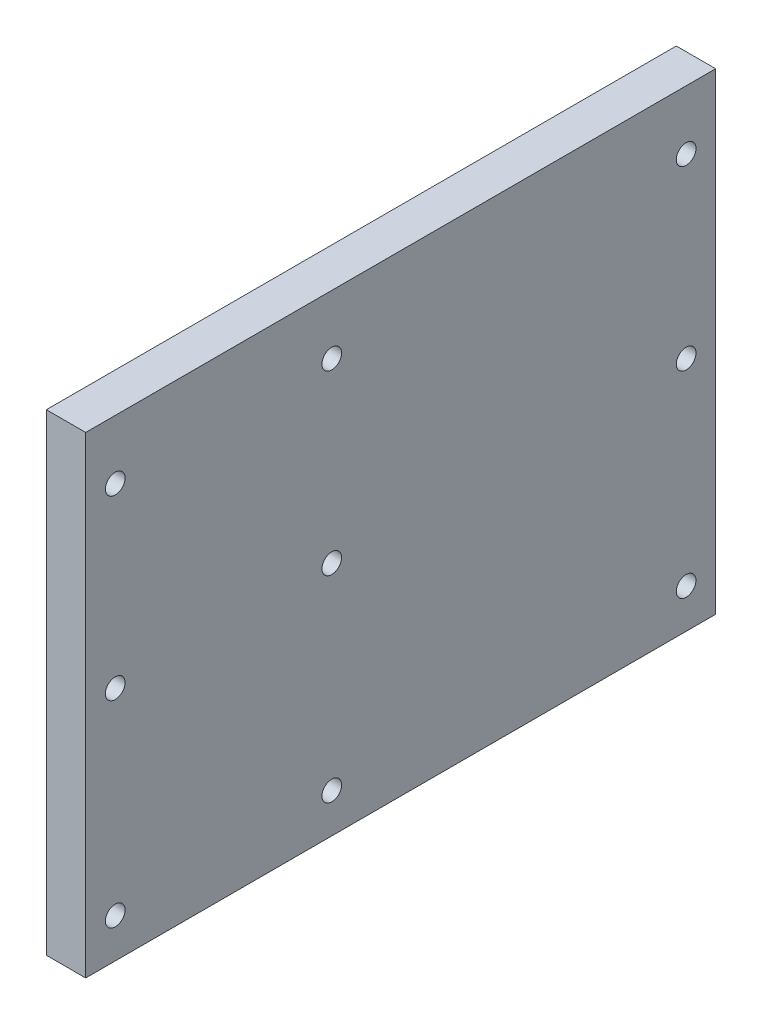
ISO-10303-21;
HEADER;
FILE_DESCRIPTION(('STEP AP214'),'2;1');
FILE_NAME('part.step','',(''),(''),'','','');
FILE_SCHEMA(('AUTOMOTIVE_DESIGN { 1 0 10303 214 1 1 1 1 }'));
ENDSEC;
DATA;
#1=APPLICATION_CONTEXT('core data for automotive mechanical design processes');
#2=APPLICATION_PROTOCOL_DEFINITION('international standard','automotive_design',2000,#1);
#3=PRODUCT_CONTEXT('',#1,'mechanical');
#4=PRODUCT('Part','Part','',(#3));
#5=PRODUCT_RELATED_PRODUCT_CATEGORY('part','',(#4));
#6=PRODUCT_DEFINITION_FORMATION('','',#4);
#7=PRODUCT_DEFINITION_CONTEXT('part definition',#1,'design');
#8=PRODUCT_DEFINITION('design','',#6,#7);
#9=PRODUCT_DEFINITION_SHAPE('','',#8);
#10=(LENGTH_UNIT() NAMED_UNIT(*) SI_UNIT(.MILLI.,.METRE.));
#11=(NAMED_UNIT(*) PLANE_ANGLE_UNIT() SI_UNIT($,.RADIAN.));
#12=(NAMED_UNIT(*) SI_UNIT($,.STERADIAN.) SOLID_ANGLE_UNIT());
#13=UNCERTAINTY_MEASURE_WITH_UNIT(LENGTH_MEASURE(1.E-05),#10,'distance_accuracy_value','');
#14=(GEOMETRIC_REPRESENTATION_CONTEXT(3) GLOBAL_UNCERTAINTY_ASSIGNED_CONTEXT((#13)) GLOBAL_UNIT_ASSIGNED_CONTEXT((#10,
#11,#12)) REPRESENTATION_CONTEXT('',''));
#15=CARTESIAN_POINT('',(0.,0.,0.));
#16=DIRECTION('',(0.,0.,1.));
#17=DIRECTION('',(1.,0.,0.));
#18=AXIS2_PLACEMENT_3D('',#15,#16,#17);
#19=CARTESIAN_POINT('',(12.7,0.,-101.6));
#20=DIRECTION('',(0.,0.,1.));
#21=DIRECTION('',(1.,0.,0.));
#22=AXIS2_PLACEMENT_3D('',#19,#20,#21);
#23=PLANE('',#22);
#24=DIRECTION('',(0.,1.,0.));
#25=VECTOR('',#24,1.);
#26=CARTESIAN_POINT('',(0.,0.,-101.6));
#27=LINE('',#26,#25);
#28=CARTESIAN_POINT('',(0.,-76.2,-101.6));
#29=VERTEX_POINT('',#28);
#30=CARTESIAN_POINT('',(0.,76.2,-101.6));
#31=VERTEX_POINT('',#30);
#32=EDGE_CURVE('E151',#29,#31,#27,.T.);
#33=ORIENTED_EDGE('',*,*,#32,.T.);
#34=DIRECTION('',(-1.,0.,0.));
#35=VECTOR('',#34,1.);
#36=CARTESIAN_POINT('',(12.7,76.2,-101.6));
#37=LINE('',#36,#35);
#38=CARTESIAN_POINT('',(12.7,76.2,-101.6));
#39=VERTEX_POINT('',#38);
#40=EDGE_CURVE('E11',#39,#31,#37,.T.);
#41=ORIENTED_EDGE('',*,*,#40,.F.);
#42=DIRECTION('',(0.,1.,0.));
#43=VECTOR('',#42,1.);
#44=CARTESIAN_POINT('',(12.7,0.,-101.6));
#45=LINE('',#44,#43);
#46=CARTESIAN_POINT('',(12.7,-76.2,-101.6));
#47=VERTEX_POINT('',#46);
#48=EDGE_CURVE('E88',#47,#39,#45,.T.);
#49=ORIENTED_EDGE('',*,*,#48,.F.);
#50=DIRECTION('',(-1.,0.,0.));
#51=VECTOR('',#50,1.);
#52=CARTESIAN_POINT('',(12.7,-76.2,-101.6));
#53=LINE('',#52,#51);
#54=EDGE_CURVE('E111',#47,#29,#53,.T.);
#55=ORIENTED_EDGE('',*,*,#54,.T.);
#56=EDGE_LOOP('',(#33,#41,#49,#55));
#57=FACE_BOUND('',#56,.T.);
#58=ADVANCED_FACE('F47',(#57),#23,.F.);
#59=CARTESIAN_POINT('',(12.7,76.2,0.));
#60=DIRECTION('',(0.,1.,0.));
#61=DIRECTION('',(0.,0.,1.));
#62=AXIS2_PLACEMENT_3D('',#59,#60,#61);
#63=PLANE('',#62);
#64=DIRECTION('',(0.,0.,-1.));
#65=VECTOR('',#64,1.);
#66=CARTESIAN_POINT('',(0.,76.2,0.));
#67=LINE('',#66,#65);
#68=CARTESIAN_POINT('',(0.,76.2,101.6));
#69=VERTEX_POINT('',#68);
#70=EDGE_CURVE('E97',#69,#31,#67,.T.);
#71=ORIENTED_EDGE('',*,*,#70,.F.);
#72=DIRECTION('',(-1.,0.,0.));
#73=VECTOR('',#72,1.);
#74=CARTESIAN_POINT('',(12.7,76.2,101.6));
#75=LINE('',#74,#73);
#76=CARTESIAN_POINT('',(12.7,76.2,101.6));
#77=VERTEX_POINT('',#76);
#78=EDGE_CURVE('E57',#77,#69,#75,.T.);
#79=ORIENTED_EDGE('',*,*,#78,.F.);
#80=DIRECTION('',(0.,0.,-1.));
#81=VECTOR('',#80,1.);
#82=CARTESIAN_POINT('',(12.7,76.2,0.));
#83=LINE('',#82,#81);
#84=EDGE_CURVE('E95',#77,#39,#83,.T.);
#85=ORIENTED_EDGE('',*,*,#84,.T.);
#86=ORIENTED_EDGE('',*,*,#40,.T.);
#87=EDGE_LOOP('',(#71,#79,#85,#86));
#88=FACE_BOUND('',#87,.T.);
#89=ADVANCED_FACE('F94',(#88),#63,.T.);
#90=CARTESIAN_POINT('',(12.7,0.,101.6));
#91=DIRECTION('',(0.,0.,1.));
#92=DIRECTION('',(1.,0.,0.));
#93=AXIS2_PLACEMENT_3D('',#90,#91,#92);
#94=PLANE('',#93);
#95=DIRECTION('',(0.,1.,0.));
#96=VECTOR('',#95,1.);
#97=CARTESIAN_POINT('',(0.,0.,101.6));
#98=LINE('',#97,#96);
#99=CARTESIAN_POINT('',(0.,-76.2,101.6));
#100=VERTEX_POINT('',#99);
#101=EDGE_CURVE('E157',#100,#69,#98,.T.);
#102=ORIENTED_EDGE('',*,*,#101,.F.);
#103=DIRECTION('',(-1.,0.,0.));
#104=VECTOR('',#103,1.);
#105=CARTESIAN_POINT('',(12.7,-76.2,101.6));
#106=LINE('',#105,#104);
#107=CARTESIAN_POINT('',(12.7,-76.2,101.6));
#108=VERTEX_POINT('',#107);
#109=EDGE_CURVE('E80',#108,#100,#106,.T.);
#110=ORIENTED_EDGE('',*,*,#109,.F.);
#111=DIRECTION('',(0.,1.,0.));
#112=VECTOR('',#111,1.);
#113=CARTESIAN_POINT('',(12.7,0.,101.6));
#114=LINE('',#113,#112);
#115=EDGE_CURVE('E104',#108,#77,#114,.T.);
#116=ORIENTED_EDGE('',*,*,#115,.T.);
#117=ORIENTED_EDGE('',*,*,#78,.T.);
#118=EDGE_LOOP('',(#102,#110,#116,#117));
#119=FACE_BOUND('',#118,.T.);
#120=ADVANCED_FACE('F107',(#119),#94,.T.);
#121=CARTESIAN_POINT('',(12.7,-63.5,92.075));
#122=DIRECTION('',(-1.,0.,0.));
#123=DIRECTION('',(0.,0.,1.));
#124=AXIS2_PLACEMENT_3D('',#121,#122,#123);
#125=CYLINDRICAL_SURFACE('',#124,3.175);
#126=CARTESIAN_POINT('',(12.7,-63.5,92.075));
#127=DIRECTION('',(1.,0.,0.));
#128=DIRECTION('',(0.,0.,-1.));
#129=AXIS2_PLACEMENT_3D('',#126,#127,#128);
#130=CIRCLE('',#129,3.175);
#131=CARTESIAN_POINT('',(12.7,-63.5,88.9));
#132=VERTEX_POINT('',#131);
#133=EDGE_CURVE('E280',#132,#132,#130,.T.);
#134=ORIENTED_EDGE('',*,*,#133,.T.);
#135=EDGE_LOOP('',(#134));
#136=FACE_BOUND('',#135,.T.);
#137=CARTESIAN_POINT('',(0.,-63.5,92.075));
#138=DIRECTION('',(1.,0.,0.));
#139=DIRECTION('',(0.,0.,-1.));
#140=AXIS2_PLACEMENT_3D('',#137,#138,#139);
#141=CIRCLE('',#140,3.175);
#142=CARTESIAN_POINT('',(0.,-63.5,88.9));
#143=VERTEX_POINT('',#142);
#144=EDGE_CURVE('E147',#143,#143,#141,.T.);
#145=ORIENTED_EDGE('',*,*,#144,.F.);
#146=EDGE_LOOP('',(#145));
#147=FACE_BOUND('',#146,.T.);
#148=ADVANCED_FACE('F189',(#136,#147),#125,.F.);
#149=CARTESIAN_POINT('',(12.7,-63.5,22.225));
#150=DIRECTION('',(-1.,0.,0.));
#151=DIRECTION('',(0.,0.,1.));
#152=AXIS2_PLACEMENT_3D('',#149,#150,#151);
#153=CYLINDRICAL_SURFACE('',#152,3.175);
#154=CARTESIAN_POINT('',(12.7,-63.5,22.225));
#155=DIRECTION('',(1.,0.,0.));
#156=DIRECTION('',(0.,0.,-1.));
#157=AXIS2_PLACEMENT_3D('',#154,#155,#156);
#158=CIRCLE('',#157,3.175);
#159=CARTESIAN_POINT('',(12.7,-63.5,19.05));
#160=VERTEX_POINT('',#159);
#161=EDGE_CURVE('E276',#160,#160,#158,.T.);
#162=ORIENTED_EDGE('',*,*,#161,.T.);
#163=EDGE_LOOP('',(#162));
#164=FACE_BOUND('',#163,.T.);
#165=CARTESIAN_POINT('',(0.,-63.5,22.225));
#166=DIRECTION('',(1.,0.,0.));
#167=DIRECTION('',(0.,0.,-1.));
#168=AXIS2_PLACEMENT_3D('',#165,#166,#167);
#169=CIRCLE('',#168,3.175);
#170=CARTESIAN_POINT('',(0.,-63.5,19.05));
#171=VERTEX_POINT('',#170);
#172=EDGE_CURVE('E143',#171,#171,#169,.T.);
#173=ORIENTED_EDGE('',*,*,#172,.F.);
#174=EDGE_LOOP('',(#173));
#175=FACE_BOUND('',#174,.T.);
#176=ADVANCED_FACE('F192',(#164,#175),#153,.F.);
#177=CARTESIAN_POINT('',(12.7,0.,92.075));
#178=DIRECTION('',(-1.,0.,0.));
#179=DIRECTION('',(0.,0.,1.));
#180=AXIS2_PLACEMENT_3D('',#177,#178,#179);
#181=CYLINDRICAL_SURFACE('',#180,3.175);
#182=CARTESIAN_POINT('',(12.7,0.,92.075));
#183=DIRECTION('',(1.,0.,0.));
#184=DIRECTION('',(0.,0.,-1.));
#185=AXIS2_PLACEMENT_3D('',#182,#183,#184);
#186=CIRCLE('',#185,3.175);
#187=CARTESIAN_POINT('',(12.7,0.,88.9));
#188=VERTEX_POINT('',#187);
#189=EDGE_CURVE('E272',#188,#188,#186,.T.);
#190=ORIENTED_EDGE('',*,*,#189,.T.);
#191=EDGE_LOOP('',(#190));
#192=FACE_BOUND('',#191,.T.);
#193=CARTESIAN_POINT('',(0.,0.,92.075));
#194=DIRECTION('',(1.,0.,0.));
#195=DIRECTION('',(0.,0.,-1.));
#196=AXIS2_PLACEMENT_3D('',#193,#194,#195);
#197=CIRCLE('',#196,3.175);
#198=CARTESIAN_POINT('',(0.,0.,88.9));
#199=VERTEX_POINT('',#198);
#200=EDGE_CURVE('E139',#199,#199,#197,.T.);
#201=ORIENTED_EDGE('',*,*,#200,.F.);
#202=EDGE_LOOP('',(#201));
#203=FACE_BOUND('',#202,.T.);
#204=ADVANCED_FACE('F196',(#192,#203),#181,.F.);
#205=CARTESIAN_POINT('',(12.7,57.15,92.075));
#206=DIRECTION('',(-1.,0.,0.));
#207=DIRECTION('',(0.,0.,1.));
#208=AXIS2_PLACEMENT_3D('',#205,#206,#207);
#209=CYLINDRICAL_SURFACE('',#208,3.175);
#210=CARTESIAN_POINT('',(12.7,57.15,92.075));
#211=DIRECTION('',(1.,0.,0.));
#212=DIRECTION('',(0.,0.,-1.));
#213=AXIS2_PLACEMENT_3D('',#210,#211,#212);
#214=CIRCLE('',#213,3.175);
#215=CARTESIAN_POINT('',(12.7,57.15,88.9));
#216=VERTEX_POINT('',#215);
#217=EDGE_CURVE('E268',#216,#216,#214,.T.);
#218=ORIENTED_EDGE('',*,*,#217,.T.);
#219=EDGE_LOOP('',(#218));
#220=FACE_BOUND('',#219,.T.);
#221=CARTESIAN_POINT('',(0.,57.15,92.075));
#222=DIRECTION('',(1.,0.,0.));
#223=DIRECTION('',(0.,0.,-1.));
#224=AXIS2_PLACEMENT_3D('',#221,#222,#223);
#225=CIRCLE('',#224,3.175);
#226=CARTESIAN_POINT('',(0.,57.15,88.9));
#227=VERTEX_POINT('',#226);
#228=EDGE_CURVE('E135',#227,#227,#225,.T.);
#229=ORIENTED_EDGE('',*,*,#228,.F.);
#230=EDGE_LOOP('',(#229));
#231=FACE_BOUND('',#230,.T.);
#232=ADVANCED_FACE('F200',(#220,#231),#209,.F.);
#233=CARTESIAN_POINT('',(12.7,-63.5,-92.075));
#234=DIRECTION('',(-1.,0.,0.));
#235=DIRECTION('',(0.,0.,1.));
#236=AXIS2_PLACEMENT_3D('',#233,#234,#235);
#237=CYLINDRICAL_SURFACE('',#236,3.175);
#238=CARTESIAN_POINT('',(12.7,-63.5,-92.075));
#239=DIRECTION('',(1.,0.,0.));
#240=DIRECTION('',(0.,0.,-1.));
#241=AXIS2_PLACEMENT_3D('',#238,#239,#240);
#242=CIRCLE('',#241,3.175);
#243=CARTESIAN_POINT('',(12.7,-63.5,-95.25));
#244=VERTEX_POINT('',#243);
#245=EDGE_CURVE('E264',#244,#244,#242,.T.);
#246=ORIENTED_EDGE('',*,*,#245,.T.);
#247=EDGE_LOOP('',(#246));
#248=FACE_BOUND('',#247,.T.);
#249=CARTESIAN_POINT('',(0.,-63.5,-92.075));
#250=DIRECTION('',(1.,0.,0.));
#251=DIRECTION('',(0.,0.,-1.));
#252=AXIS2_PLACEMENT_3D('',#249,#250,#251);
#253=CIRCLE('',#252,3.175);
#254=CARTESIAN_POINT('',(0.,-63.5,-95.25));
#255=VERTEX_POINT('',#254);
#256=EDGE_CURVE('E131',#255,#255,#253,.T.);
#257=ORIENTED_EDGE('',*,*,#256,.F.);
#258=EDGE_LOOP('',(#257));
#259=FACE_BOUND('',#258,.T.);
#260=ADVANCED_FACE('F204',(#248,#259),#237,.F.);
#261=CARTESIAN_POINT('',(12.7,0.,22.225));
#262=DIRECTION('',(-1.,0.,0.));
#263=DIRECTION('',(0.,0.,1.));
#264=AXIS2_PLACEMENT_3D('',#261,#262,#263);
#265=CYLINDRICAL_SURFACE('',#264,3.175);
#266=CARTESIAN_POINT('',(12.7,0.,22.225));
#267=DIRECTION('',(1.,0.,0.));
#268=DIRECTION('',(0.,0.,-1.));
#269=AXIS2_PLACEMENT_3D('',#266,#267,#268);
#270=CIRCLE('',#269,3.175);
#271=CARTESIAN_POINT('',(12.7,0.,19.05));
#272=VERTEX_POINT('',#271);
#273=EDGE_CURVE('E256',#272,#272,#270,.T.);
#274=ORIENTED_EDGE('',*,*,#273,.T.);
#275=EDGE_LOOP('',(#274));
#276=FACE_BOUND('',#275,.T.);
#277=CARTESIAN_POINT('',(0.,0.,22.225));
#278=DIRECTION('',(1.,0.,0.));
#279=DIRECTION('',(0.,0.,-1.));
#280=AXIS2_PLACEMENT_3D('',#277,#278,#279);
#281=CIRCLE('',#280,3.175);
#282=CARTESIAN_POINT('',(0.,0.,19.05));
#283=VERTEX_POINT('',#282);
#284=EDGE_CURVE('E127',#283,#283,#281,.T.);
#285=ORIENTED_EDGE('',*,*,#284,.F.);
#286=EDGE_LOOP('',(#285));
#287=FACE_BOUND('',#286,.T.);
#288=ADVANCED_FACE('F208',(#276,#287),#265,.F.);
#289=CARTESIAN_POINT('',(12.7,57.15,22.225));
#290=DIRECTION('',(-1.,0.,0.));
#291=DIRECTION('',(0.,0.,1.));
#292=AXIS2_PLACEMENT_3D('',#289,#290,#291);
#293=CYLINDRICAL_SURFACE('',#292,3.175);
#294=CARTESIAN_POINT('',(12.7,57.15,22.225));
#295=DIRECTION('',(1.,0.,0.));
#296=DIRECTION('',(0.,0.,-1.));
#297=AXIS2_PLACEMENT_3D('',#294,#295,#296);
#298=CIRCLE('',#297,3.175);
#299=CARTESIAN_POINT('',(12.7,57.15,19.05));
#300=VERTEX_POINT('',#299);
#301=EDGE_CURVE('E251',#300,#300,#298,.T.);
#302=ORIENTED_EDGE('',*,*,#301,.T.);
#303=EDGE_LOOP('',(#302));
#304=FACE_BOUND('',#303,.T.);
#305=CARTESIAN_POINT('',(0.,57.15,22.225));
#306=DIRECTION('',(1.,0.,0.));
#307=DIRECTION('',(0.,0.,-1.));
#308=AXIS2_PLACEMENT_3D('',#305,#306,#307);
#309=CIRCLE('',#308,3.175);
#310=CARTESIAN_POINT('',(0.,57.15,19.05));
#311=VERTEX_POINT('',#310);
#312=EDGE_CURVE('E123',#311,#311,#309,.T.);
#313=ORIENTED_EDGE('',*,*,#312,.F.);
#314=EDGE_LOOP('',(#313));
#315=FACE_BOUND('',#314,.T.);
#316=ADVANCED_FACE('F212',(#304,#315),#293,.F.);
#317=CARTESIAN_POINT('',(12.7,0.,-92.075));
#318=DIRECTION('',(-1.,0.,0.));
#319=DIRECTION('',(0.,0.,1.));
#320=AXIS2_PLACEMENT_3D('',#317,#318,#319);
#321=CYLINDRICAL_SURFACE('',#320,3.175);
#322=CARTESIAN_POINT('',(12.7,0.,-92.075));
#323=DIRECTION('',(1.,0.,0.));
#324=DIRECTION('',(0.,0.,-1.));
#325=AXIS2_PLACEMENT_3D('',#322,#323,#324);
#326=CIRCLE('',#325,3.175);
#327=CARTESIAN_POINT('',(12.7,0.,-95.25));
#328=VERTEX_POINT('',#327);
#329=EDGE_CURVE('E226',#328,#328,#326,.T.);
#330=ORIENTED_EDGE('',*,*,#329,.T.);
#331=EDGE_LOOP('',(#330));
#332=FACE_BOUND('',#331,.T.);
#333=CARTESIAN_POINT('',(0.,0.,-92.075));
#334=DIRECTION('',(1.,0.,0.));
#335=DIRECTION('',(0.,0.,-1.));
#336=AXIS2_PLACEMENT_3D('',#333,#334,#335);
#337=CIRCLE('',#336,3.175);
#338=CARTESIAN_POINT('',(0.,0.,-95.25));
#339=VERTEX_POINT('',#338);
#340=EDGE_CURVE('E119',#339,#339,#337,.T.);
#341=ORIENTED_EDGE('',*,*,#340,.F.);
#342=EDGE_LOOP('',(#341));
#343=FACE_BOUND('',#342,.T.);
#344=ADVANCED_FACE('F215',(#332,#343),#321,.F.);
#345=CARTESIAN_POINT('',(12.7,57.15,-92.075));
#346=DIRECTION('',(-1.,0.,0.));
#347=DIRECTION('',(0.,0.,1.));
#348=AXIS2_PLACEMENT_3D('',#345,#346,#347);
#349=CYLINDRICAL_SURFACE('',#348,3.175);
#350=CARTESIAN_POINT('',(12.7,57.15,-92.075));
#351=DIRECTION('',(1.,0.,0.));
#352=DIRECTION('',(0.,0.,-1.));
#353=AXIS2_PLACEMENT_3D('',#350,#351,#352);
#354=CIRCLE('',#353,3.175);
#355=CARTESIAN_POINT('',(12.7,57.15,-95.25));
#356=VERTEX_POINT('',#355);
#357=EDGE_CURVE('E162',#356,#356,#354,.T.);
#358=ORIENTED_EDGE('',*,*,#357,.T.);
#359=EDGE_LOOP('',(#358));
#360=FACE_BOUND('',#359,.T.);
#361=CARTESIAN_POINT('',(0.,57.15,-92.075));
#362=DIRECTION('',(1.,0.,0.));
#363=DIRECTION('',(0.,0.,-1.));
#364=AXIS2_PLACEMENT_3D('',#361,#362,#363);
#365=CIRCLE('',#364,3.175);
#366=CARTESIAN_POINT('',(0.,57.15,-95.25));
#367=VERTEX_POINT('',#366);
#368=EDGE_CURVE('E115',#367,#367,#365,.T.);
#369=ORIENTED_EDGE('',*,*,#368,.F.);
#370=EDGE_LOOP('',(#369));
#371=FACE_BOUND('',#370,.T.);
#372=ADVANCED_FACE('F49',(#360,#371),#349,.F.);
#373=CARTESIAN_POINT('',(12.7,-76.2,0.));
#374=DIRECTION('',(0.,1.,0.));
#375=DIRECTION('',(0.,0.,1.));
#376=AXIS2_PLACEMENT_3D('',#373,#374,#375);
#377=PLANE('',#376);
#378=DIRECTION('',(0.,0.,-1.));
#379=VECTOR('',#378,1.);
#380=CARTESIAN_POINT('',(0.,-76.2,0.));
#381=LINE('',#380,#379);
#382=EDGE_CURVE('E83',#100,#29,#381,.T.);
#383=ORIENTED_EDGE('',*,*,#382,.T.);
#384=ORIENTED_EDGE('',*,*,#54,.F.);
#385=DIRECTION('',(0.,0.,-1.));
#386=VECTOR('',#385,1.);
#387=CARTESIAN_POINT('',(12.7,-76.2,0.));
#388=LINE('',#387,#386);
#389=EDGE_CURVE('E65',#108,#47,#388,.T.);
#390=ORIENTED_EDGE('',*,*,#389,.F.);
#391=ORIENTED_EDGE('',*,*,#109,.T.);
#392=EDGE_LOOP('',(#383,#384,#390,#391));
#393=FACE_BOUND('',#392,.T.);
#394=ADVANCED_FACE('F176',(#393),#377,.F.);
#395=CARTESIAN_POINT('',(12.7,0.,0.));
#396=DIRECTION('',(1.,0.,0.));
#397=DIRECTION('',(0.,0.,-1.));
#398=AXIS2_PLACEMENT_3D('',#395,#396,#397);
#399=PLANE('',#398);
#400=ORIENTED_EDGE('',*,*,#357,.F.);
#401=EDGE_LOOP('',(#400));
#402=FACE_BOUND('',#401,.T.);
#403=ORIENTED_EDGE('',*,*,#329,.F.);
#404=EDGE_LOOP('',(#403));
#405=FACE_BOUND('',#404,.T.);
#406=ORIENTED_EDGE('',*,*,#301,.F.);
#407=EDGE_LOOP('',(#406));
#408=FACE_BOUND('',#407,.T.);
#409=ORIENTED_EDGE('',*,*,#273,.F.);
#410=EDGE_LOOP('',(#409));
#411=FACE_BOUND('',#410,.T.);
#412=ORIENTED_EDGE('',*,*,#245,.F.);
#413=EDGE_LOOP('',(#412));
#414=FACE_BOUND('',#413,.T.);
#415=ORIENTED_EDGE('',*,*,#217,.F.);
#416=EDGE_LOOP('',(#415));
#417=FACE_BOUND('',#416,.T.);
#418=ORIENTED_EDGE('',*,*,#189,.F.);
#419=EDGE_LOOP('',(#418));
#420=FACE_BOUND('',#419,.T.);
#421=ORIENTED_EDGE('',*,*,#161,.F.);
#422=EDGE_LOOP('',(#421));
#423=FACE_BOUND('',#422,.T.);
#424=ORIENTED_EDGE('',*,*,#133,.F.);
#425=EDGE_LOOP('',(#424));
#426=FACE_BOUND('',#425,.T.);
#427=ORIENTED_EDGE('',*,*,#48,.T.);
#428=ORIENTED_EDGE('',*,*,#84,.F.);
#429=ORIENTED_EDGE('',*,*,#115,.F.);
#430=ORIENTED_EDGE('',*,*,#389,.T.);
#431=EDGE_LOOP('',(#427,#428,#429,#430));
#432=FACE_BOUND('',#431,.T.);
#433=ADVANCED_FACE('F103',(#402,#405,#408,#411,#414,#417,#420,#423,#426,#432),#399,.T.);
#434=CARTESIAN_POINT('',(0.,0.,0.));
#435=DIRECTION('',(1.,0.,0.));
#436=DIRECTION('',(0.,0.,-1.));
#437=AXIS2_PLACEMENT_3D('',#434,#435,#436);
#438=PLANE('',#437);
#439=ORIENTED_EDGE('',*,*,#368,.T.);
#440=EDGE_LOOP('',(#439));
#441=FACE_BOUND('',#440,.T.);
#442=ORIENTED_EDGE('',*,*,#340,.T.);
#443=EDGE_LOOP('',(#442));
#444=FACE_BOUND('',#443,.T.);
#445=ORIENTED_EDGE('',*,*,#312,.T.);
#446=EDGE_LOOP('',(#445));
#447=FACE_BOUND('',#446,.T.);
#448=ORIENTED_EDGE('',*,*,#284,.T.);
#449=EDGE_LOOP('',(#448));
#450=FACE_BOUND('',#449,.T.);
#451=ORIENTED_EDGE('',*,*,#256,.T.);
#452=EDGE_LOOP('',(#451));
#453=FACE_BOUND('',#452,.T.);
#454=ORIENTED_EDGE('',*,*,#228,.T.);
#455=EDGE_LOOP('',(#454));
#456=FACE_BOUND('',#455,.T.);
#457=ORIENTED_EDGE('',*,*,#200,.T.);
#458=EDGE_LOOP('',(#457));
#459=FACE_BOUND('',#458,.T.);
#460=ORIENTED_EDGE('',*,*,#172,.T.);
#461=EDGE_LOOP('',(#460));
#462=FACE_BOUND('',#461,.T.);
#463=ORIENTED_EDGE('',*,*,#144,.T.);
#464=EDGE_LOOP('',(#463));
#465=FACE_BOUND('',#464,.T.);
#466=ORIENTED_EDGE('',*,*,#32,.F.);
#467=ORIENTED_EDGE('',*,*,#382,.F.);
#468=ORIENTED_EDGE('',*,*,#101,.T.);
#469=ORIENTED_EDGE('',*,*,#70,.T.);
#470=EDGE_LOOP('',(#466,#467,#468,#469));
#471=FACE_BOUND('',#470,.T.);
#472=ADVANCED_FACE('F169',(#441,#444,#447,#450,#453,#456,#459,#462,#465,#471),#438,.F.);
#473=CLOSED_SHELL('',(#58,#89,#120,#148,#176,#204,#232,#260,#288,#316,#344,#372,#394,#433,#472));
#474=MANIFOLD_SOLID_BREP('B2',#473);
#475=ADVANCED_BREP_SHAPE_REPRESENTATION('',(#18,#474),#14);
#476=SHAPE_DEFINITION_REPRESENTATION(#9,#475);
ENDSEC;
END-ISO-10303-21;
